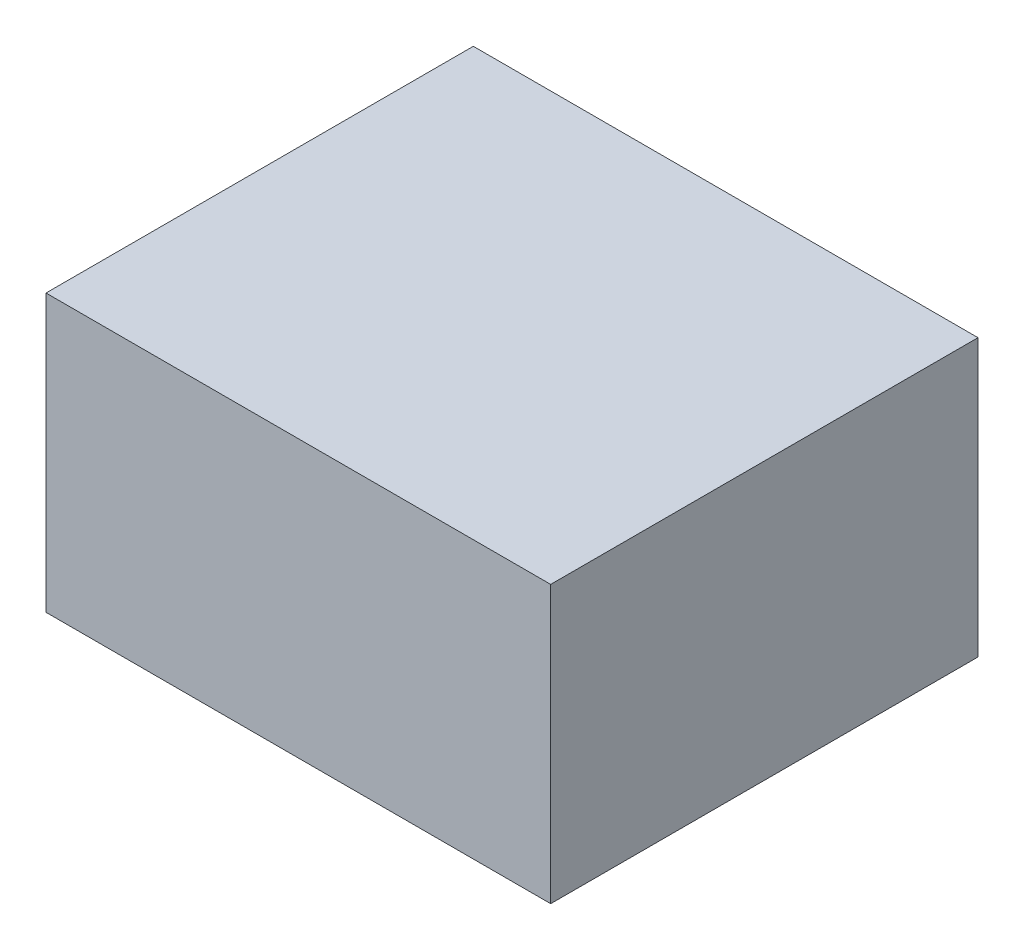
ISO-10303-21;
HEADER;
FILE_DESCRIPTION(('STEP AP214'),'2;1');
FILE_NAME('part.step','',(''),(''),'','','');
FILE_SCHEMA(('AUTOMOTIVE_DESIGN { 1 0 10303 214 1 1 1 1 }'));
ENDSEC;
DATA;
#1=APPLICATION_CONTEXT('core data for automotive mechanical design processes');
#2=APPLICATION_PROTOCOL_DEFINITION('international standard','automotive_design',2000,#1);
#3=PRODUCT_CONTEXT('',#1,'mechanical');
#4=PRODUCT('Part','Part','',(#3));
#5=PRODUCT_RELATED_PRODUCT_CATEGORY('part','',(#4));
#6=PRODUCT_DEFINITION_FORMATION('','',#4);
#7=PRODUCT_DEFINITION_CONTEXT('part definition',#1,'design');
#8=PRODUCT_DEFINITION('design','',#6,#7);
#9=PRODUCT_DEFINITION_SHAPE('','',#8);
#10=(LENGTH_UNIT() NAMED_UNIT(*) SI_UNIT(.MILLI.,.METRE.));
#11=(NAMED_UNIT(*) PLANE_ANGLE_UNIT() SI_UNIT($,.RADIAN.));
#12=(NAMED_UNIT(*) SI_UNIT($,.STERADIAN.) SOLID_ANGLE_UNIT());
#13=UNCERTAINTY_MEASURE_WITH_UNIT(LENGTH_MEASURE(1.E-05),#10,'distance_accuracy_value','');
#14=(GEOMETRIC_REPRESENTATION_CONTEXT(3) GLOBAL_UNCERTAINTY_ASSIGNED_CONTEXT((#13)) GLOBAL_UNIT_ASSIGNED_CONTEXT((#10,
#11,#12)) REPRESENTATION_CONTEXT('',''));
#15=CARTESIAN_POINT('',(0.,0.,0.));
#16=DIRECTION('',(0.,0.,1.));
#17=DIRECTION('',(1.,0.,0.));
#18=AXIS2_PLACEMENT_3D('',#15,#16,#17);
#19=CARTESIAN_POINT('',(-20.0525,15.5175,7.127));
#20=DIRECTION('',(1.,0.,0.));
#21=DIRECTION('',(0.,0.,-1.));
#22=AXIS2_PLACEMENT_3D('',#19,#20,#21);
#23=PLANE('',#22);
#24=DIRECTION('',(0.,0.,-1.));
#25=VECTOR('',#24,1.);
#26=CARTESIAN_POINT('',(-20.0525,15.5175,7.127));
#27=LINE('',#26,#25);
#28=CARTESIAN_POINT('',(-20.0525,15.5175,7.127));
#29=VERTEX_POINT('',#28);
#30=CARTESIAN_POINT('',(-20.0525,15.5175,-19.729));
#31=VERTEX_POINT('',#30);
#32=EDGE_CURVE('E97',#29,#31,#27,.T.);
#33=ORIENTED_EDGE('',*,*,#32,.T.);
#34=DIRECTION('',(0.,-1.,0.));
#35=VECTOR('',#34,1.);
#36=CARTESIAN_POINT('',(-20.0525,15.5175,-19.729));
#37=LINE('',#36,#35);
#38=CARTESIAN_POINT('',(-20.0525,-1.8635,-19.729));
#39=VERTEX_POINT('',#38);
#40=EDGE_CURVE('E93',#31,#39,#37,.T.);
#41=ORIENTED_EDGE('',*,*,#40,.T.);
#42=DIRECTION('',(0.,0.,-1.));
#43=VECTOR('',#42,1.);
#44=CARTESIAN_POINT('',(-20.0525,-1.8635,7.127));
#45=LINE('',#44,#43);
#46=CARTESIAN_POINT('',(-20.0525,-1.8635,7.127));
#47=VERTEX_POINT('',#46);
#48=EDGE_CURVE('E11',#47,#39,#45,.T.);
#49=ORIENTED_EDGE('',*,*,#48,.F.);
#50=DIRECTION('',(0.,-1.,0.));
#51=VECTOR('',#50,1.);
#52=CARTESIAN_POINT('',(-20.0525,15.5175,7.127));
#53=LINE('',#52,#51);
#54=EDGE_CURVE('E101',#29,#47,#53,.T.);
#55=ORIENTED_EDGE('',*,*,#54,.F.);
#56=EDGE_LOOP('',(#33,#41,#49,#55));
#57=FACE_BOUND('',#56,.T.);
#58=ADVANCED_FACE('F41',(#57),#23,.F.);
#59=CARTESIAN_POINT('',(-20.0525,-1.8635,7.127));
#60=DIRECTION('',(0.,1.,0.));
#61=DIRECTION('',(0.,0.,1.));
#62=AXIS2_PLACEMENT_3D('',#59,#60,#61);
#63=PLANE('',#62);
#64=ORIENTED_EDGE('',*,*,#48,.T.);
#65=DIRECTION('',(1.,0.,0.));
#66=VECTOR('',#65,1.);
#67=CARTESIAN_POINT('',(-20.0525,-1.8635,-19.729));
#68=LINE('',#67,#66);
#69=CARTESIAN_POINT('',(11.6665,-1.8635,-19.729));
#70=VERTEX_POINT('',#69);
#71=EDGE_CURVE('E81',#39,#70,#68,.T.);
#72=ORIENTED_EDGE('',*,*,#71,.T.);
#73=DIRECTION('',(0.,0.,-1.));
#74=VECTOR('',#73,1.);
#75=CARTESIAN_POINT('',(11.6665,-1.8635,7.127));
#76=LINE('',#75,#74);
#77=CARTESIAN_POINT('',(11.6665,-1.8635,7.127));
#78=VERTEX_POINT('',#77);
#79=EDGE_CURVE('E48',#78,#70,#76,.T.);
#80=ORIENTED_EDGE('',*,*,#79,.F.);
#81=DIRECTION('',(1.,0.,0.));
#82=VECTOR('',#81,1.);
#83=CARTESIAN_POINT('',(-20.0525,-1.8635,7.127));
#84=LINE('',#83,#82);
#85=EDGE_CURVE('E84',#47,#78,#84,.T.);
#86=ORIENTED_EDGE('',*,*,#85,.F.);
#87=EDGE_LOOP('',(#64,#72,#80,#86));
#88=FACE_BOUND('',#87,.T.);
#89=ADVANCED_FACE('F83',(#88),#63,.F.);
#90=CARTESIAN_POINT('',(11.6665,-1.8635,7.127));
#91=DIRECTION('',(-1.,0.,0.));
#92=DIRECTION('',(0.,0.,1.));
#93=AXIS2_PLACEMENT_3D('',#90,#91,#92);
#94=PLANE('',#93);
#95=ORIENTED_EDGE('',*,*,#79,.T.);
#96=DIRECTION('',(0.,1.,0.));
#97=VECTOR('',#96,1.);
#98=CARTESIAN_POINT('',(11.6665,-1.8635,-19.729));
#99=LINE('',#98,#97);
#100=CARTESIAN_POINT('',(11.6665,15.5175,-19.729));
#101=VERTEX_POINT('',#100);
#102=EDGE_CURVE('E96',#70,#101,#99,.T.);
#103=ORIENTED_EDGE('',*,*,#102,.T.);
#104=DIRECTION('',(0.,0.,-1.));
#105=VECTOR('',#104,1.);
#106=CARTESIAN_POINT('',(11.6665,15.5175,7.127));
#107=LINE('',#106,#105);
#108=CARTESIAN_POINT('',(11.6665,15.5175,7.127));
#109=VERTEX_POINT('',#108);
#110=EDGE_CURVE('E108',#109,#101,#107,.T.);
#111=ORIENTED_EDGE('',*,*,#110,.F.);
#112=DIRECTION('',(0.,1.,0.));
#113=VECTOR('',#112,1.);
#114=CARTESIAN_POINT('',(11.6665,-1.8635,7.127));
#115=LINE('',#114,#113);
#116=EDGE_CURVE('E58',#78,#109,#115,.T.);
#117=ORIENTED_EDGE('',*,*,#116,.F.);
#118=EDGE_LOOP('',(#95,#103,#111,#117));
#119=FACE_BOUND('',#118,.T.);
#120=ADVANCED_FACE('F115',(#119),#94,.F.);
#121=CARTESIAN_POINT('',(11.6665,15.5175,7.127));
#122=DIRECTION('',(0.,-1.,0.));
#123=DIRECTION('',(0.,0.,-1.));
#124=AXIS2_PLACEMENT_3D('',#121,#122,#123);
#125=PLANE('',#124);
#126=ORIENTED_EDGE('',*,*,#110,.T.);
#127=DIRECTION('',(-1.,0.,0.));
#128=VECTOR('',#127,1.);
#129=CARTESIAN_POINT('',(11.6665,15.5175,-19.729));
#130=LINE('',#129,#128);
#131=EDGE_CURVE('E105',#101,#31,#130,.T.);
#132=ORIENTED_EDGE('',*,*,#131,.T.);
#133=ORIENTED_EDGE('',*,*,#32,.F.);
#134=DIRECTION('',(-1.,0.,0.));
#135=VECTOR('',#134,1.);
#136=CARTESIAN_POINT('',(11.6665,15.5175,7.127));
#137=LINE('',#136,#135);
#138=EDGE_CURVE('E54',#109,#29,#137,.T.);
#139=ORIENTED_EDGE('',*,*,#138,.F.);
#140=EDGE_LOOP('',(#126,#132,#133,#139));
#141=FACE_BOUND('',#140,.T.);
#142=ADVANCED_FACE('F114',(#141),#125,.F.);
#143=CARTESIAN_POINT('',(0.,0.,7.127));
#144=DIRECTION('',(0.,0.,1.));
#145=DIRECTION('',(1.,0.,0.));
#146=AXIS2_PLACEMENT_3D('',#143,#144,#145);
#147=PLANE('',#146);
#148=ORIENTED_EDGE('',*,*,#54,.T.);
#149=ORIENTED_EDGE('',*,*,#85,.T.);
#150=ORIENTED_EDGE('',*,*,#116,.T.);
#151=ORIENTED_EDGE('',*,*,#138,.T.);
#152=EDGE_LOOP('',(#148,#149,#150,#151));
#153=FACE_BOUND('',#152,.T.);
#154=ADVANCED_FACE('F113',(#153),#147,.T.);
#155=CARTESIAN_POINT('',(0.,0.,-19.729));
#156=DIRECTION('',(0.,0.,1.));
#157=DIRECTION('',(1.,0.,0.));
#158=AXIS2_PLACEMENT_3D('',#155,#156,#157);
#159=PLANE('',#158);
#160=ORIENTED_EDGE('',*,*,#40,.F.);
#161=ORIENTED_EDGE('',*,*,#131,.F.);
#162=ORIENTED_EDGE('',*,*,#102,.F.);
#163=ORIENTED_EDGE('',*,*,#71,.F.);
#164=EDGE_LOOP('',(#160,#161,#162,#163));
#165=FACE_BOUND('',#164,.T.);
#166=ADVANCED_FACE('F91',(#165),#159,.F.);
#167=CLOSED_SHELL('',(#58,#89,#120,#142,#154,#166));
#168=MANIFOLD_SOLID_BREP('B2',#167);
#169=ADVANCED_BREP_SHAPE_REPRESENTATION('',(#18,#168),#14);
#170=SHAPE_DEFINITION_REPRESENTATION(#9,#169);
ENDSEC;
END-ISO-10303-21;
